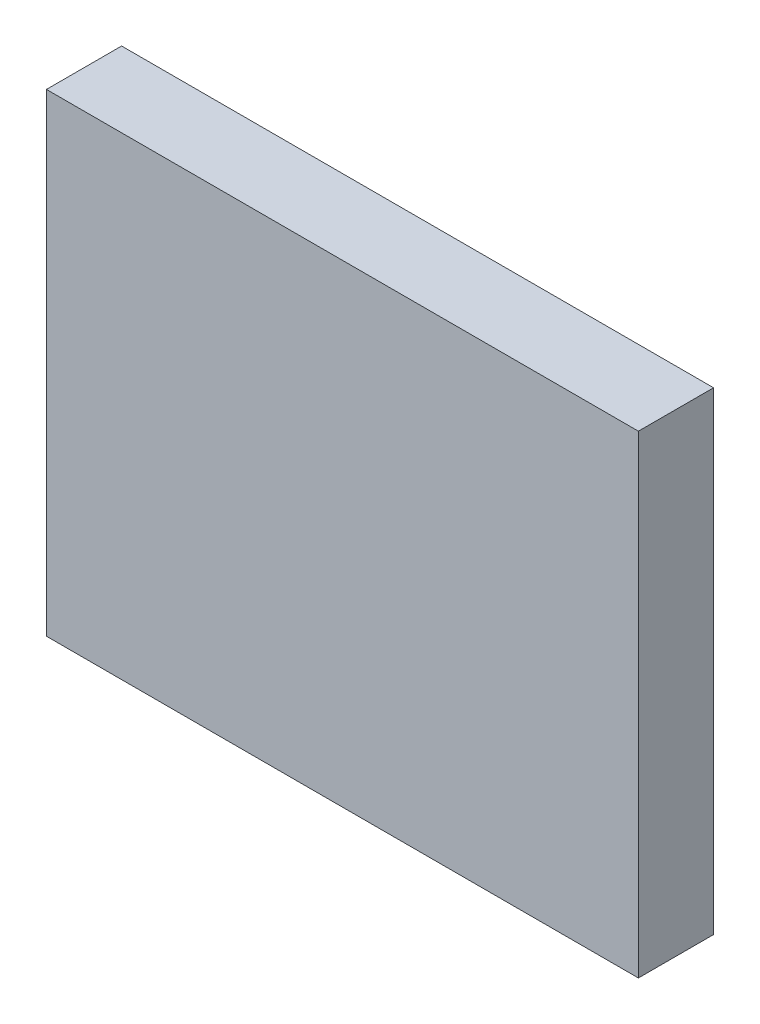
ISO-10303-21;
HEADER;
FILE_DESCRIPTION(('STEP AP214'),'2;1');
FILE_NAME('part.step','',(''),(''),'','','');
FILE_SCHEMA(('AUTOMOTIVE_DESIGN { 1 0 10303 214 1 1 1 1 }'));
ENDSEC;
DATA;
#1=APPLICATION_CONTEXT('core data for automotive mechanical design processes');
#2=APPLICATION_PROTOCOL_DEFINITION('international standard','automotive_design',2000,#1);
#3=PRODUCT_CONTEXT('',#1,'mechanical');
#4=PRODUCT('Part','Part','',(#3));
#5=PRODUCT_RELATED_PRODUCT_CATEGORY('part','',(#4));
#6=PRODUCT_DEFINITION_FORMATION('','',#4);
#7=PRODUCT_DEFINITION_CONTEXT('part definition',#1,'design');
#8=PRODUCT_DEFINITION('design','',#6,#7);
#9=PRODUCT_DEFINITION_SHAPE('','',#8);
#10=(LENGTH_UNIT() NAMED_UNIT(*) SI_UNIT(.MILLI.,.METRE.));
#11=(NAMED_UNIT(*) PLANE_ANGLE_UNIT() SI_UNIT($,.RADIAN.));
#12=(NAMED_UNIT(*) SI_UNIT($,.STERADIAN.) SOLID_ANGLE_UNIT());
#13=UNCERTAINTY_MEASURE_WITH_UNIT(LENGTH_MEASURE(1.E-05),#10,'distance_accuracy_value','');
#14=(GEOMETRIC_REPRESENTATION_CONTEXT(3) GLOBAL_UNCERTAINTY_ASSIGNED_CONTEXT((#13)) GLOBAL_UNIT_ASSIGNED_CONTEXT((#10,
#11,#12)) REPRESENTATION_CONTEXT('',''));
#15=CARTESIAN_POINT('',(0.,0.,0.));
#16=DIRECTION('',(0.,0.,1.));
#17=DIRECTION('',(1.,0.,0.));
#18=AXIS2_PLACEMENT_3D('',#15,#16,#17);
#19=CARTESIAN_POINT('',(-100.,-80.,25.4));
#20=DIRECTION('',(1.,0.,0.));
#21=DIRECTION('',(0.,0.,-1.));
#22=AXIS2_PLACEMENT_3D('',#19,#20,#21);
#23=PLANE('',#22);
#24=DIRECTION('',(0.,-1.,0.));
#25=VECTOR('',#24,1.);
#26=CARTESIAN_POINT('',(-100.,-80.,0.));
#27=LINE('',#26,#25);
#28=CARTESIAN_POINT('',(-100.,80.,0.));
#29=VERTEX_POINT('',#28);
#30=CARTESIAN_POINT('',(-100.,-80.,0.));
#31=VERTEX_POINT('',#30);
#32=EDGE_CURVE('E96',#29,#31,#27,.T.);
#33=ORIENTED_EDGE('',*,*,#32,.T.);
#34=DIRECTION('',(0.,0.,-1.));
#35=VECTOR('',#34,1.);
#36=CARTESIAN_POINT('',(-100.,-80.,25.4));
#37=LINE('',#36,#35);
#38=CARTESIAN_POINT('',(-100.,-80.,25.4));
#39=VERTEX_POINT('',#38);
#40=EDGE_CURVE('E11',#39,#31,#37,.T.);
#41=ORIENTED_EDGE('',*,*,#40,.F.);
#42=DIRECTION('',(0.,-1.,0.));
#43=VECTOR('',#42,1.);
#44=CARTESIAN_POINT('',(-100.,-80.,25.4));
#45=LINE('',#44,#43);
#46=CARTESIAN_POINT('',(-100.,80.,25.4));
#47=VERTEX_POINT('',#46);
#48=EDGE_CURVE('E84',#47,#39,#45,.T.);
#49=ORIENTED_EDGE('',*,*,#48,.F.);
#50=DIRECTION('',(0.,0.,-1.));
#51=VECTOR('',#50,1.);
#52=CARTESIAN_POINT('',(-100.,80.,25.4));
#53=LINE('',#52,#51);
#54=EDGE_CURVE('E92',#47,#29,#53,.T.);
#55=ORIENTED_EDGE('',*,*,#54,.T.);
#56=EDGE_LOOP('',(#33,#41,#49,#55));
#57=FACE_BOUND('',#56,.T.);
#58=ADVANCED_FACE('F33',(#57),#23,.F.);
#59=CARTESIAN_POINT('',(100.,-80.,25.4));
#60=DIRECTION('',(0.,1.,0.));
#61=DIRECTION('',(-1.,0.,0.));
#62=AXIS2_PLACEMENT_3D('',#59,#60,#61);
#63=PLANE('',#62);
#64=DIRECTION('',(1.,0.,0.));
#65=VECTOR('',#64,1.);
#66=CARTESIAN_POINT('',(100.,-80.,0.));
#67=LINE('',#66,#65);
#68=CARTESIAN_POINT('',(100.,-80.,0.));
#69=VERTEX_POINT('',#68);
#70=EDGE_CURVE('E88',#31,#69,#67,.T.);
#71=ORIENTED_EDGE('',*,*,#70,.T.);
#72=DIRECTION('',(0.,0.,-1.));
#73=VECTOR('',#72,1.);
#74=CARTESIAN_POINT('',(100.,-80.,25.4));
#75=LINE('',#74,#73);
#76=CARTESIAN_POINT('',(100.,-80.,25.4));
#77=VERTEX_POINT('',#76);
#78=EDGE_CURVE('E41',#77,#69,#75,.T.);
#79=ORIENTED_EDGE('',*,*,#78,.F.);
#80=DIRECTION('',(1.,0.,0.));
#81=VECTOR('',#80,1.);
#82=CARTESIAN_POINT('',(100.,-80.,25.4));
#83=LINE('',#82,#81);
#84=EDGE_CURVE('E79',#39,#77,#83,.T.);
#85=ORIENTED_EDGE('',*,*,#84,.F.);
#86=ORIENTED_EDGE('',*,*,#40,.T.);
#87=EDGE_LOOP('',(#71,#79,#85,#86));
#88=FACE_BOUND('',#87,.T.);
#89=ADVANCED_FACE('F87',(#88),#63,.F.);
#90=CARTESIAN_POINT('',(100.,-80.,25.4));
#91=DIRECTION('',(-1.,0.,0.));
#92=DIRECTION('',(0.,0.,1.));
#93=AXIS2_PLACEMENT_3D('',#90,#91,#92);
#94=PLANE('',#93);
#95=DIRECTION('',(0.,1.,0.));
#96=VECTOR('',#95,1.);
#97=CARTESIAN_POINT('',(100.,-80.,0.));
#98=LINE('',#97,#96);
#99=CARTESIAN_POINT('',(100.,80.,0.));
#100=VERTEX_POINT('',#99);
#101=EDGE_CURVE('E66',#69,#100,#98,.T.);
#102=ORIENTED_EDGE('',*,*,#101,.T.);
#103=DIRECTION('',(0.,0.,-1.));
#104=VECTOR('',#103,1.);
#105=CARTESIAN_POINT('',(100.,80.,25.4));
#106=LINE('',#105,#104);
#107=CARTESIAN_POINT('',(100.,80.,25.4));
#108=VERTEX_POINT('',#107);
#109=EDGE_CURVE('E89',#108,#100,#106,.T.);
#110=ORIENTED_EDGE('',*,*,#109,.F.);
#111=DIRECTION('',(0.,1.,0.));
#112=VECTOR('',#111,1.);
#113=CARTESIAN_POINT('',(100.,-80.,25.4));
#114=LINE('',#113,#112);
#115=EDGE_CURVE('E82',#77,#108,#114,.T.);
#116=ORIENTED_EDGE('',*,*,#115,.F.);
#117=ORIENTED_EDGE('',*,*,#78,.T.);
#118=EDGE_LOOP('',(#102,#110,#116,#117));
#119=FACE_BOUND('',#118,.T.);
#120=ADVANCED_FACE('F90',(#119),#94,.F.);
#121=CARTESIAN_POINT('',(100.,80.,25.4));
#122=DIRECTION('',(0.,-1.,0.));
#123=DIRECTION('',(1.,0.,0.));
#124=AXIS2_PLACEMENT_3D('',#121,#122,#123);
#125=PLANE('',#124);
#126=DIRECTION('',(-1.,0.,0.));
#127=VECTOR('',#126,1.);
#128=CARTESIAN_POINT('',(100.,80.,0.));
#129=LINE('',#128,#127);
#130=EDGE_CURVE('E72',#100,#29,#129,.T.);
#131=ORIENTED_EDGE('',*,*,#130,.T.);
#132=ORIENTED_EDGE('',*,*,#54,.F.);
#133=DIRECTION('',(-1.,0.,0.));
#134=VECTOR('',#133,1.);
#135=CARTESIAN_POINT('',(100.,80.,25.4));
#136=LINE('',#135,#134);
#137=EDGE_CURVE('E49',#108,#47,#136,.T.);
#138=ORIENTED_EDGE('',*,*,#137,.F.);
#139=ORIENTED_EDGE('',*,*,#109,.T.);
#140=EDGE_LOOP('',(#131,#132,#138,#139));
#141=FACE_BOUND('',#140,.T.);
#142=ADVANCED_FACE('F103',(#141),#125,.F.);
#143=CARTESIAN_POINT('',(0.,0.,25.4));
#144=DIRECTION('',(0.,0.,1.));
#145=DIRECTION('',(1.,0.,0.));
#146=AXIS2_PLACEMENT_3D('',#143,#144,#145);
#147=PLANE('',#146);
#148=ORIENTED_EDGE('',*,*,#48,.T.);
#149=ORIENTED_EDGE('',*,*,#84,.T.);
#150=ORIENTED_EDGE('',*,*,#115,.T.);
#151=ORIENTED_EDGE('',*,*,#137,.T.);
#152=EDGE_LOOP('',(#148,#149,#150,#151));
#153=FACE_BOUND('',#152,.T.);
#154=ADVANCED_FACE('F80',(#153),#147,.T.);
#155=CARTESIAN_POINT('',(0.,0.,0.));
#156=DIRECTION('',(0.,0.,1.));
#157=DIRECTION('',(1.,0.,0.));
#158=AXIS2_PLACEMENT_3D('',#155,#156,#157);
#159=PLANE('',#158);
#160=ORIENTED_EDGE('',*,*,#32,.F.);
#161=ORIENTED_EDGE('',*,*,#130,.F.);
#162=ORIENTED_EDGE('',*,*,#101,.F.);
#163=ORIENTED_EDGE('',*,*,#70,.F.);
#164=EDGE_LOOP('',(#160,#161,#162,#163));
#165=FACE_BOUND('',#164,.T.);
#166=ADVANCED_FACE('F106',(#165),#159,.F.);
#167=CLOSED_SHELL('',(#58,#89,#120,#142,#154,#166));
#168=MANIFOLD_SOLID_BREP('B2',#167);
#169=ADVANCED_BREP_SHAPE_REPRESENTATION('',(#18,#168),#14);
#170=SHAPE_DEFINITION_REPRESENTATION(#9,#169);
ENDSEC;
END-ISO-10303-21;
